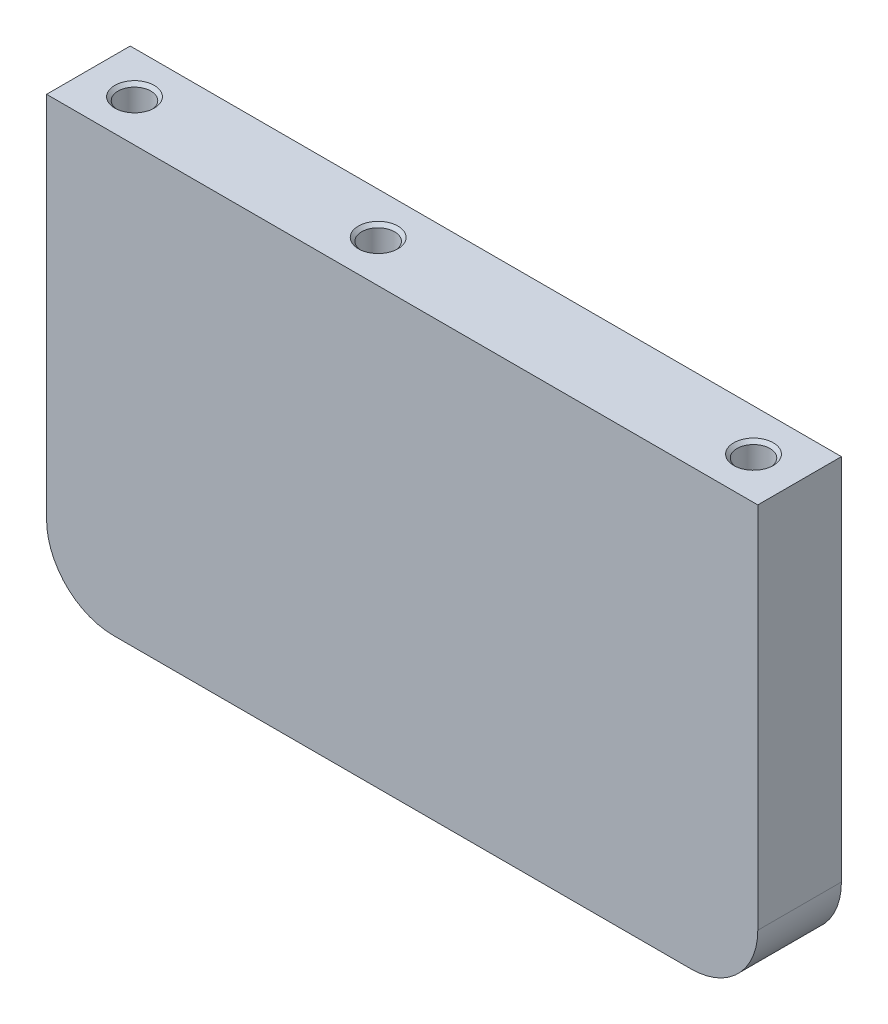
ISO-10303-21;
HEADER;
FILE_DESCRIPTION(('STEP AP214'),'2;1');
FILE_NAME('part.step','',(''),(''),'','','');
FILE_SCHEMA(('AUTOMOTIVE_DESIGN { 1 0 10303 214 1 1 1 1 }'));
ENDSEC;
DATA;
#1=APPLICATION_CONTEXT('core data for automotive mechanical design processes');
#2=APPLICATION_PROTOCOL_DEFINITION('international standard','automotive_design',2000,#1);
#3=PRODUCT_CONTEXT('',#1,'mechanical');
#4=PRODUCT('Part','Part','',(#3));
#5=PRODUCT_RELATED_PRODUCT_CATEGORY('part','',(#4));
#6=PRODUCT_DEFINITION_FORMATION('','',#4);
#7=PRODUCT_DEFINITION_CONTEXT('part definition',#1,'design');
#8=PRODUCT_DEFINITION('design','',#6,#7);
#9=PRODUCT_DEFINITION_SHAPE('','',#8);
#10=(LENGTH_UNIT() NAMED_UNIT(*) SI_UNIT(.MILLI.,.METRE.));
#11=(NAMED_UNIT(*) PLANE_ANGLE_UNIT() SI_UNIT($,.RADIAN.));
#12=(NAMED_UNIT(*) SI_UNIT($,.STERADIAN.) SOLID_ANGLE_UNIT());
#13=UNCERTAINTY_MEASURE_WITH_UNIT(LENGTH_MEASURE(1.E-05),#10,'distance_accuracy_value','');
#14=(GEOMETRIC_REPRESENTATION_CONTEXT(3) GLOBAL_UNCERTAINTY_ASSIGNED_CONTEXT((#13)) GLOBAL_UNIT_ASSIGNED_CONTEXT((#10,
#11,#12)) REPRESENTATION_CONTEXT('',''));
#15=CARTESIAN_POINT('',(0.,0.,0.));
#16=DIRECTION('',(0.,0.,1.));
#17=DIRECTION('',(1.,0.,0.));
#18=AXIS2_PLACEMENT_3D('',#15,#16,#17);
#19=CARTESIAN_POINT('',(-36.,19.05,-6.35));
#20=DIRECTION('',(-1.,0.,0.));
#21=DIRECTION('',(0.,-1.,0.));
#22=AXIS2_PLACEMENT_3D('',#19,#20,#21);
#23=PLANE('',#22);
#24=DIRECTION('',(0.,-1.,0.));
#25=VECTOR('',#24,1.);
#26=CARTESIAN_POINT('',(-36.,19.05,-6.35));
#27=LINE('',#26,#25);
#28=CARTESIAN_POINT('',(-36.,19.05,-6.35));
#29=VERTEX_POINT('',#28);
#30=CARTESIAN_POINT('',(-36.,-8.92,-6.35));
#31=VERTEX_POINT('',#30);
#32=EDGE_CURVE('E116',#29,#31,#27,.T.);
#33=ORIENTED_EDGE('',*,*,#32,.T.);
#34=DIRECTION('',(0.,0.,1.));
#35=VECTOR('',#34,1.);
#36=CARTESIAN_POINT('',(-36.,-8.92,-6.35));
#37=LINE('',#36,#35);
#38=CARTESIAN_POINT('',(-36.,-8.92,0.));
#39=VERTEX_POINT('',#38);
#40=EDGE_CURVE('E157',#31,#39,#37,.T.);
#41=ORIENTED_EDGE('',*,*,#40,.T.);
#42=DIRECTION('',(0.,-1.,0.));
#43=VECTOR('',#42,1.);
#44=CARTESIAN_POINT('',(-36.,19.05,0.));
#45=LINE('',#44,#43);
#46=CARTESIAN_POINT('',(-36.,19.05,0.));
#47=VERTEX_POINT('',#46);
#48=EDGE_CURVE('E121',#47,#39,#45,.T.);
#49=ORIENTED_EDGE('',*,*,#48,.F.);
#50=DIRECTION('',(0.,0.,1.));
#51=VECTOR('',#50,1.);
#52=CARTESIAN_POINT('',(-36.,19.05,-6.35));
#53=LINE('',#52,#51);
#54=EDGE_CURVE('E113',#29,#47,#53,.T.);
#55=ORIENTED_EDGE('',*,*,#54,.F.);
#56=EDGE_LOOP('',(#33,#41,#49,#55));
#57=FACE_BOUND('',#56,.T.);
#58=ADVANCED_FACE('F41',(#57),#23,.T.);
#59=CARTESIAN_POINT('',(-36.,19.05,-6.35));
#60=DIRECTION('',(0.,1.,0.));
#61=DIRECTION('',(0.,0.,1.));
#62=AXIS2_PLACEMENT_3D('',#59,#60,#61);
#63=PLANE('',#62);
#64=CARTESIAN_POINT('',(14.5,19.05,-3.17500000000004));
#65=DIRECTION('',(0.,1.,0.));
#66=DIRECTION('',(0.,0.,1.));
#67=AXIS2_PLACEMENT_3D('',#64,#65,#66);
#68=CIRCLE('',#67,1.5);
#69=CARTESIAN_POINT('',(14.5,19.05,-1.67500000000004));
#70=VERTEX_POINT('',#69);
#71=EDGE_CURVE('E173',#70,#70,#68,.F.);
#72=ORIENTED_EDGE('',*,*,#71,.T.);
#73=EDGE_LOOP('',(#72));
#74=FACE_BOUND('',#73,.T.);
#75=CARTESIAN_POINT('',(-14.0000000000001,19.05,-3.17500000000004));
#76=DIRECTION('',(0.,1.,0.));
#77=DIRECTION('',(0.,0.,1.));
#78=AXIS2_PLACEMENT_3D('',#75,#76,#77);
#79=CIRCLE('',#78,1.5);
#80=CARTESIAN_POINT('',(-14.0000000000001,19.05,-1.67500000000004));
#81=VERTEX_POINT('',#80);
#82=EDGE_CURVE('E169',#81,#81,#79,.F.);
#83=ORIENTED_EDGE('',*,*,#82,.T.);
#84=EDGE_LOOP('',(#83));
#85=FACE_BOUND('',#84,.T.);
#86=CARTESIAN_POINT('',(-32.5,19.05,-3.175));
#87=DIRECTION('',(0.,1.,0.));
#88=DIRECTION('',(0.,0.,1.));
#89=AXIS2_PLACEMENT_3D('',#86,#87,#88);
#90=CIRCLE('',#89,1.5);
#91=CARTESIAN_POINT('',(-32.5,19.05,-1.675));
#92=VERTEX_POINT('',#91);
#93=EDGE_CURVE('E165',#92,#92,#90,.F.);
#94=ORIENTED_EDGE('',*,*,#93,.T.);
#95=EDGE_LOOP('',(#94));
#96=FACE_BOUND('',#95,.T.);
#97=DIRECTION('',(-1.,0.,0.));
#98=VECTOR('',#97,1.);
#99=CARTESIAN_POINT('',(-36.,19.05,0.));
#100=LINE('',#99,#98);
#101=CARTESIAN_POINT('',(18.,19.05,0.));
#102=VERTEX_POINT('',#101);
#103=EDGE_CURVE('E111',#102,#47,#100,.T.);
#104=ORIENTED_EDGE('',*,*,#103,.F.);
#105=DIRECTION('',(0.,0.,1.));
#106=VECTOR('',#105,1.);
#107=CARTESIAN_POINT('',(18.,19.05,-6.35));
#108=LINE('',#107,#106);
#109=CARTESIAN_POINT('',(18.,19.05,-6.35));
#110=VERTEX_POINT('',#109);
#111=EDGE_CURVE('E99',#110,#102,#108,.T.);
#112=ORIENTED_EDGE('',*,*,#111,.F.);
#113=DIRECTION('',(-1.,0.,0.));
#114=VECTOR('',#113,1.);
#115=CARTESIAN_POINT('',(-36.,19.05,-6.35));
#116=LINE('',#115,#114);
#117=EDGE_CURVE('E104',#110,#29,#116,.T.);
#118=ORIENTED_EDGE('',*,*,#117,.T.);
#119=ORIENTED_EDGE('',*,*,#54,.T.);
#120=EDGE_LOOP('',(#104,#112,#118,#119));
#121=FACE_BOUND('',#120,.T.);
#122=ADVANCED_FACE('F109',(#74,#85,#96,#121),#63,.T.);
#123=CARTESIAN_POINT('',(18.,19.05,-6.35));
#124=DIRECTION('',(1.,0.,0.));
#125=DIRECTION('',(0.,1.,0.));
#126=AXIS2_PLACEMENT_3D('',#123,#124,#125);
#127=PLANE('',#126);
#128=DIRECTION('',(0.,1.,0.));
#129=VECTOR('',#128,1.);
#130=CARTESIAN_POINT('',(18.,19.05,0.));
#131=LINE('',#130,#129);
#132=CARTESIAN_POINT('',(18.,-8.92,0.));
#133=VERTEX_POINT('',#132);
#134=EDGE_CURVE('E130',#133,#102,#131,.T.);
#135=ORIENTED_EDGE('',*,*,#134,.F.);
#136=DIRECTION('',(0.,0.,1.));
#137=VECTOR('',#136,1.);
#138=CARTESIAN_POINT('',(18.,-8.92,-6.35));
#139=LINE('',#138,#137);
#140=CARTESIAN_POINT('',(18.,-8.92,-6.35));
#141=VERTEX_POINT('',#140);
#142=EDGE_CURVE('E65',#133,#141,#139,.F.);
#143=ORIENTED_EDGE('',*,*,#142,.T.);
#144=DIRECTION('',(0.,1.,0.));
#145=VECTOR('',#144,1.);
#146=CARTESIAN_POINT('',(18.,19.05,-6.35));
#147=LINE('',#146,#145);
#148=EDGE_CURVE('E96',#141,#110,#147,.T.);
#149=ORIENTED_EDGE('',*,*,#148,.T.);
#150=ORIENTED_EDGE('',*,*,#111,.T.);
#151=EDGE_LOOP('',(#135,#143,#149,#150));
#152=FACE_BOUND('',#151,.T.);
#153=ADVANCED_FACE('F98',(#152),#127,.T.);
#154=CARTESIAN_POINT('',(-36.,-14.,-6.35));
#155=DIRECTION('',(0.,-1.,0.));
#156=DIRECTION('',(0.,0.,-1.));
#157=AXIS2_PLACEMENT_3D('',#154,#155,#156);
#158=PLANE('',#157);
#159=DIRECTION('',(1.,0.,0.));
#160=VECTOR('',#159,1.);
#161=CARTESIAN_POINT('',(-36.,-14.,-6.35));
#162=LINE('',#161,#160);
#163=CARTESIAN_POINT('',(-30.92,-14.,-6.35));
#164=VERTEX_POINT('',#163);
#165=CARTESIAN_POINT('',(12.92,-14.,-6.35));
#166=VERTEX_POINT('',#165);
#167=EDGE_CURVE('E105',#164,#166,#162,.T.);
#168=ORIENTED_EDGE('',*,*,#167,.T.);
#169=DIRECTION('',(0.,0.,1.));
#170=VECTOR('',#169,1.);
#171=CARTESIAN_POINT('',(12.92,-14.,-6.35));
#172=LINE('',#171,#170);
#173=CARTESIAN_POINT('',(12.92,-14.,0.));
#174=VERTEX_POINT('',#173);
#175=EDGE_CURVE('E140',#166,#174,#172,.T.);
#176=ORIENTED_EDGE('',*,*,#175,.T.);
#177=DIRECTION('',(1.,0.,0.));
#178=VECTOR('',#177,1.);
#179=CARTESIAN_POINT('',(-36.,-14.,0.));
#180=LINE('',#179,#178);
#181=CARTESIAN_POINT('',(-30.92,-14.,0.));
#182=VERTEX_POINT('',#181);
#183=EDGE_CURVE('E125',#182,#174,#180,.T.);
#184=ORIENTED_EDGE('',*,*,#183,.F.);
#185=DIRECTION('',(0.,0.,1.));
#186=VECTOR('',#185,1.);
#187=CARTESIAN_POINT('',(-30.92,-14.,-6.35));
#188=LINE('',#187,#186);
#189=EDGE_CURVE('E136',#182,#164,#188,.F.);
#190=ORIENTED_EDGE('',*,*,#189,.T.);
#191=EDGE_LOOP('',(#168,#176,#184,#190));
#192=FACE_BOUND('',#191,.T.);
#193=ADVANCED_FACE('F206',(#192),#158,.T.);
#194=CARTESIAN_POINT('',(0.,0.,-6.35));
#195=DIRECTION('',(0.,0.,1.));
#196=DIRECTION('',(1.,0.,0.));
#197=AXIS2_PLACEMENT_3D('',#194,#195,#196);
#198=PLANE('',#197);
#199=CARTESIAN_POINT('',(-25.,0.,-6.35));
#200=DIRECTION('',(0.,0.,-1.));
#201=DIRECTION('',(-1.,0.,0.));
#202=AXIS2_PLACEMENT_3D('',#199,#200,#201);
#203=CIRCLE('',#202,3.35);
#204=CARTESIAN_POINT('',(-28.35,0.,-6.35));
#205=VERTEX_POINT('',#204);
#206=EDGE_CURVE('E252',#205,#205,#203,.T.);
#207=ORIENTED_EDGE('',*,*,#206,.F.);
#208=EDGE_LOOP('',(#207));
#209=FACE_BOUND('',#208,.T.);
#210=CARTESIAN_POINT('',(0.,0.,-6.35));
#211=DIRECTION('',(0.,0.,-1.));
#212=DIRECTION('',(-1.,0.,0.));
#213=AXIS2_PLACEMENT_3D('',#210,#211,#212);
#214=CIRCLE('',#213,11.05);
#215=CARTESIAN_POINT('',(-11.05,0.,-6.35));
#216=VERTEX_POINT('',#215);
#217=EDGE_CURVE('E253',#216,#216,#214,.T.);
#218=ORIENTED_EDGE('',*,*,#217,.F.);
#219=EDGE_LOOP('',(#218));
#220=FACE_BOUND('',#219,.T.);
#221=ORIENTED_EDGE('',*,*,#148,.F.);
#222=CARTESIAN_POINT('',(12.92,-8.92,-6.35));
#223=DIRECTION('',(0.,0.,1.));
#224=DIRECTION('',(1.,0.,0.));
#225=AXIS2_PLACEMENT_3D('',#222,#223,#224);
#226=CIRCLE('',#225,5.08);
#227=EDGE_CURVE('E154',#141,#166,#226,.F.);
#228=ORIENTED_EDGE('',*,*,#227,.T.);
#229=ORIENTED_EDGE('',*,*,#167,.F.);
#230=CARTESIAN_POINT('',(-30.92,-8.92,-6.35));
#231=DIRECTION('',(0.,0.,1.));
#232=DIRECTION('',(1.,0.,0.));
#233=AXIS2_PLACEMENT_3D('',#230,#231,#232);
#234=CIRCLE('',#233,5.08);
#235=EDGE_CURVE('E57',#164,#31,#234,.F.);
#236=ORIENTED_EDGE('',*,*,#235,.T.);
#237=ORIENTED_EDGE('',*,*,#32,.F.);
#238=ORIENTED_EDGE('',*,*,#117,.F.);
#239=EDGE_LOOP('',(#221,#228,#229,#236,#237,#238));
#240=FACE_BOUND('',#239,.T.);
#241=ADVANCED_FACE('F115',(#209,#220,#240),#198,.F.);
#242=CARTESIAN_POINT('',(0.,0.,0.));
#243=DIRECTION('',(0.,0.,1.));
#244=DIRECTION('',(1.,0.,0.));
#245=AXIS2_PLACEMENT_3D('',#242,#243,#244);
#246=PLANE('',#245);
#247=ORIENTED_EDGE('',*,*,#183,.T.);
#248=CARTESIAN_POINT('',(12.92,-8.92,0.));
#249=DIRECTION('',(0.,0.,1.));
#250=DIRECTION('',(1.,0.,0.));
#251=AXIS2_PLACEMENT_3D('',#248,#249,#250);
#252=CIRCLE('',#251,5.08);
#253=EDGE_CURVE('E147',#174,#133,#252,.T.);
#254=ORIENTED_EDGE('',*,*,#253,.T.);
#255=ORIENTED_EDGE('',*,*,#134,.T.);
#256=ORIENTED_EDGE('',*,*,#103,.T.);
#257=ORIENTED_EDGE('',*,*,#48,.T.);
#258=CARTESIAN_POINT('',(-30.92,-8.92,0.));
#259=DIRECTION('',(0.,0.,1.));
#260=DIRECTION('',(1.,0.,0.));
#261=AXIS2_PLACEMENT_3D('',#258,#259,#260);
#262=CIRCLE('',#261,5.08);
#263=EDGE_CURVE('E144',#39,#182,#262,.T.);
#264=ORIENTED_EDGE('',*,*,#263,.T.);
#265=EDGE_LOOP('',(#247,#254,#255,#256,#257,#264));
#266=FACE_BOUND('',#265,.T.);
#267=ADVANCED_FACE('F227',(#266),#246,.T.);
#268=CARTESIAN_POINT('',(14.5,4.05,-3.17500000000004));
#269=DIRECTION('',(0.,1.,0.));
#270=DIRECTION('',(0.,0.,1.));
#271=AXIS2_PLACEMENT_3D('',#268,#269,#270);
#272=CYLINDRICAL_SURFACE('',#271,1.25);
#273=CARTESIAN_POINT('',(14.5,18.8,-3.17500000000004));
#274=DIRECTION('',(0.,1.,0.));
#275=DIRECTION('',(0.,0.,1.));
#276=AXIS2_PLACEMENT_3D('',#273,#274,#275);
#277=CIRCLE('',#276,1.25);
#278=CARTESIAN_POINT('',(14.5,18.8,-1.92500000000004));
#279=VERTEX_POINT('',#278);
#280=EDGE_CURVE('E161',#279,#279,#277,.T.);
#281=ORIENTED_EDGE('',*,*,#280,.T.);
#282=EDGE_LOOP('',(#281));
#283=FACE_BOUND('',#282,.T.);
#284=CARTESIAN_POINT('',(14.5,4.05,-3.17500000000004));
#285=DIRECTION('',(0.,1.,0.));
#286=DIRECTION('',(0.,0.,1.));
#287=AXIS2_PLACEMENT_3D('',#284,#285,#286);
#288=CIRCLE('',#287,1.25);
#289=CARTESIAN_POINT('',(14.5,4.05,-1.92500000000004));
#290=VERTEX_POINT('',#289);
#291=EDGE_CURVE('E236',#290,#290,#288,.T.);
#292=ORIENTED_EDGE('',*,*,#291,.F.);
#293=EDGE_LOOP('',(#292));
#294=FACE_BOUND('',#293,.T.);
#295=ADVANCED_FACE('F299',(#283,#294),#272,.F.);
#296=CARTESIAN_POINT('',(14.5,4.05,-3.17500000000004));
#297=DIRECTION('',(0.,1.,0.));
#298=DIRECTION('',(0.,0.,1.));
#299=AXIS2_PLACEMENT_3D('',#296,#297,#298);
#300=PLANE('',#299);
#301=ORIENTED_EDGE('',*,*,#291,.T.);
#302=EDGE_LOOP('',(#301));
#303=FACE_BOUND('',#302,.T.);
#304=ADVANCED_FACE('F296',(#303),#300,.T.);
#305=CARTESIAN_POINT('',(-14.0000000000001,4.05,-3.17500000000004));
#306=DIRECTION('',(0.,1.,0.));
#307=DIRECTION('',(0.,0.,1.));
#308=AXIS2_PLACEMENT_3D('',#305,#306,#307);
#309=CYLINDRICAL_SURFACE('',#308,1.25);
#310=CARTESIAN_POINT('',(-14.0000000000001,18.8,-3.17500000000004));
#311=DIRECTION('',(0.,1.,0.));
#312=DIRECTION('',(0.,0.,1.));
#313=AXIS2_PLACEMENT_3D('',#310,#311,#312);
#314=CIRCLE('',#313,1.25);
#315=CARTESIAN_POINT('',(-14.0000000000001,18.8,-1.92500000000004));
#316=VERTEX_POINT('',#315);
#317=EDGE_CURVE('E50',#316,#316,#314,.T.);
#318=ORIENTED_EDGE('',*,*,#317,.T.);
#319=EDGE_LOOP('',(#318));
#320=FACE_BOUND('',#319,.T.);
#321=CARTESIAN_POINT('',(-14.0000000000001,4.05,-3.17500000000004));
#322=DIRECTION('',(0.,1.,0.));
#323=DIRECTION('',(0.,0.,1.));
#324=AXIS2_PLACEMENT_3D('',#321,#322,#323);
#325=CIRCLE('',#324,1.25);
#326=CARTESIAN_POINT('',(-14.0000000000001,4.05,-1.92500000000004));
#327=VERTEX_POINT('',#326);
#328=EDGE_CURVE('E240',#327,#327,#325,.T.);
#329=ORIENTED_EDGE('',*,*,#328,.F.);
#330=EDGE_LOOP('',(#329));
#331=FACE_BOUND('',#330,.T.);
#332=ADVANCED_FACE('F180',(#320,#331),#309,.F.);
#333=CARTESIAN_POINT('',(-14.0000000000001,4.05,-3.17500000000004));
#334=DIRECTION('',(0.,1.,0.));
#335=DIRECTION('',(0.,0.,1.));
#336=AXIS2_PLACEMENT_3D('',#333,#334,#335);
#337=PLANE('',#336);
#338=ORIENTED_EDGE('',*,*,#328,.T.);
#339=EDGE_LOOP('',(#338));
#340=FACE_BOUND('',#339,.T.);
#341=ADVANCED_FACE('F289',(#340),#337,.T.);
#342=CARTESIAN_POINT('',(-32.5,4.05,-3.175));
#343=DIRECTION('',(0.,1.,0.));
#344=DIRECTION('',(0.,0.,1.));
#345=AXIS2_PLACEMENT_3D('',#342,#343,#344);
#346=CYLINDRICAL_SURFACE('',#345,1.25);
#347=CARTESIAN_POINT('',(-32.5,18.8,-3.175));
#348=DIRECTION('',(0.,1.,0.));
#349=DIRECTION('',(0.,0.,1.));
#350=AXIS2_PLACEMENT_3D('',#347,#348,#349);
#351=CIRCLE('',#350,1.25);
#352=CARTESIAN_POINT('',(-32.5,18.8,-1.925));
#353=VERTEX_POINT('',#352);
#354=EDGE_CURVE('E12',#353,#353,#351,.T.);
#355=ORIENTED_EDGE('',*,*,#354,.T.);
#356=EDGE_LOOP('',(#355));
#357=FACE_BOUND('',#356,.T.);
#358=CARTESIAN_POINT('',(-32.5,4.05,-3.175));
#359=DIRECTION('',(0.,1.,0.));
#360=DIRECTION('',(0.,0.,1.));
#361=AXIS2_PLACEMENT_3D('',#358,#359,#360);
#362=CIRCLE('',#361,1.25);
#363=CARTESIAN_POINT('',(-32.5,4.05,-1.925));
#364=VERTEX_POINT('',#363);
#365=EDGE_CURVE('E126',#364,#364,#362,.T.);
#366=ORIENTED_EDGE('',*,*,#365,.F.);
#367=EDGE_LOOP('',(#366));
#368=FACE_BOUND('',#367,.T.);
#369=ADVANCED_FACE('F285',(#357,#368),#346,.F.);
#370=CARTESIAN_POINT('',(-32.5,4.05,-3.175));
#371=DIRECTION('',(0.,1.,0.));
#372=DIRECTION('',(0.,0.,1.));
#373=AXIS2_PLACEMENT_3D('',#370,#371,#372);
#374=PLANE('',#373);
#375=ORIENTED_EDGE('',*,*,#365,.T.);
#376=EDGE_LOOP('',(#375));
#377=FACE_BOUND('',#376,.T.);
#378=ADVANCED_FACE('F212',(#377),#374,.T.);
#379=CARTESIAN_POINT('',(12.92,-8.92,-6.35));
#380=DIRECTION('',(0.,0.,1.));
#381=DIRECTION('',(1.,0.,0.));
#382=AXIS2_PLACEMENT_3D('',#379,#380,#381);
#383=CYLINDRICAL_SURFACE('',#382,5.08);
#384=ORIENTED_EDGE('',*,*,#227,.F.);
#385=ORIENTED_EDGE('',*,*,#142,.F.);
#386=ORIENTED_EDGE('',*,*,#253,.F.);
#387=ORIENTED_EDGE('',*,*,#175,.F.);
#388=EDGE_LOOP('',(#384,#385,#386,#387));
#389=FACE_BOUND('',#388,.T.);
#390=ADVANCED_FACE('F208',(#389),#383,.T.);
#391=CARTESIAN_POINT('',(-30.92,-8.92,-6.35));
#392=DIRECTION('',(0.,0.,1.));
#393=DIRECTION('',(1.,0.,0.));
#394=AXIS2_PLACEMENT_3D('',#391,#392,#393);
#395=CYLINDRICAL_SURFACE('',#394,5.08);
#396=ORIENTED_EDGE('',*,*,#235,.F.);
#397=ORIENTED_EDGE('',*,*,#189,.F.);
#398=ORIENTED_EDGE('',*,*,#263,.F.);
#399=ORIENTED_EDGE('',*,*,#40,.F.);
#400=EDGE_LOOP('',(#396,#397,#398,#399));
#401=FACE_BOUND('',#400,.T.);
#402=ADVANCED_FACE('F211',(#401),#395,.T.);
#403=CARTESIAN_POINT('',(0.,0.,-1.5875));
#404=DIRECTION('',(0.,0.,1.));
#405=DIRECTION('',(1.,0.,0.));
#406=AXIS2_PLACEMENT_3D('',#403,#404,#405);
#407=PLANE('',#406);
#408=CARTESIAN_POINT('',(0.,0.,-1.5875));
#409=DIRECTION('',(0.,0.,1.));
#410=DIRECTION('',(1.,0.,0.));
#411=AXIS2_PLACEMENT_3D('',#408,#409,#410);
#412=CIRCLE('',#411,11.05);
#413=CARTESIAN_POINT('',(11.05,0.,-1.5875));
#414=VERTEX_POINT('',#413);
#415=EDGE_CURVE('E248',#414,#414,#412,.F.);
#416=ORIENTED_EDGE('',*,*,#415,.T.);
#417=EDGE_LOOP('',(#416));
#418=FACE_BOUND('',#417,.T.);
#419=ADVANCED_FACE('F215',(#418),#407,.F.);
#420=CARTESIAN_POINT('',(0.,0.,31.2541197284454));
#421=DIRECTION('',(0.,0.,-1.));
#422=DIRECTION('',(-1.,0.,0.));
#423=AXIS2_PLACEMENT_3D('',#420,#421,#422);
#424=CYLINDRICAL_SURFACE('',#423,11.05);
#425=ORIENTED_EDGE('',*,*,#217,.T.);
#426=EDGE_LOOP('',(#425));
#427=FACE_BOUND('',#426,.T.);
#428=ORIENTED_EDGE('',*,*,#415,.F.);
#429=EDGE_LOOP('',(#428));
#430=FACE_BOUND('',#429,.T.);
#431=ADVANCED_FACE('F220',(#427,#430),#424,.F.);
#432=CARTESIAN_POINT('',(0.,0.,-1.5875));
#433=DIRECTION('',(0.,0.,1.));
#434=DIRECTION('',(1.,0.,0.));
#435=AXIS2_PLACEMENT_3D('',#432,#433,#434);
#436=PLANE('',#435);
#437=CARTESIAN_POINT('',(-25.,0.,-1.5875));
#438=DIRECTION('',(0.,0.,1.));
#439=DIRECTION('',(1.,0.,0.));
#440=AXIS2_PLACEMENT_3D('',#437,#438,#439);
#441=CIRCLE('',#440,3.35);
#442=CARTESIAN_POINT('',(-21.65,0.,-1.5875));
#443=VERTEX_POINT('',#442);
#444=EDGE_CURVE('E241',#443,#443,#441,.F.);
#445=ORIENTED_EDGE('',*,*,#444,.T.);
#446=EDGE_LOOP('',(#445));
#447=FACE_BOUND('',#446,.T.);
#448=ADVANCED_FACE('F273',(#447),#436,.F.);
#449=CARTESIAN_POINT('',(-25.,0.,31.2541197284454));
#450=DIRECTION('',(0.,0.,-1.));
#451=DIRECTION('',(-1.,0.,0.));
#452=AXIS2_PLACEMENT_3D('',#449,#450,#451);
#453=CYLINDRICAL_SURFACE('',#452,3.35);
#454=ORIENTED_EDGE('',*,*,#206,.T.);
#455=EDGE_LOOP('',(#454));
#456=FACE_BOUND('',#455,.T.);
#457=ORIENTED_EDGE('',*,*,#444,.F.);
#458=EDGE_LOOP('',(#457));
#459=FACE_BOUND('',#458,.T.);
#460=ADVANCED_FACE('F192',(#456,#459),#453,.F.);
#461=CARTESIAN_POINT('',(14.5,18.8,-3.17500000000004));
#462=DIRECTION('',(0.,1.,0.));
#463=DIRECTION('',(0.,0.,1.));
#464=AXIS2_PLACEMENT_3D('',#461,#462,#463);
#465=CONICAL_SURFACE('',#464,1.25,0.785398163397441);
#466=ORIENTED_EDGE('',*,*,#71,.F.);
#467=EDGE_LOOP('',(#466));
#468=FACE_BOUND('',#467,.T.);
#469=ORIENTED_EDGE('',*,*,#280,.F.);
#470=EDGE_LOOP('',(#469));
#471=FACE_BOUND('',#470,.T.);
#472=ADVANCED_FACE('F185',(#468,#471),#465,.F.);
#473=CARTESIAN_POINT('',(-14.0000000000001,18.8,-3.17500000000004));
#474=DIRECTION('',(0.,1.,0.));
#475=DIRECTION('',(0.,0.,1.));
#476=AXIS2_PLACEMENT_3D('',#473,#474,#475);
#477=CONICAL_SURFACE('',#476,1.25,0.785398163397441);
#478=ORIENTED_EDGE('',*,*,#82,.F.);
#479=EDGE_LOOP('',(#478));
#480=FACE_BOUND('',#479,.T.);
#481=ORIENTED_EDGE('',*,*,#317,.F.);
#482=EDGE_LOOP('',(#481));
#483=FACE_BOUND('',#482,.T.);
#484=ADVANCED_FACE('F183',(#480,#483),#477,.F.);
#485=CARTESIAN_POINT('',(-32.5,18.8,-3.175));
#486=DIRECTION('',(0.,1.,0.));
#487=DIRECTION('',(0.,0.,1.));
#488=AXIS2_PLACEMENT_3D('',#485,#486,#487);
#489=CONICAL_SURFACE('',#488,1.25,0.785398163397441);
#490=ORIENTED_EDGE('',*,*,#93,.F.);
#491=EDGE_LOOP('',(#490));
#492=FACE_BOUND('',#491,.T.);
#493=ORIENTED_EDGE('',*,*,#354,.F.);
#494=EDGE_LOOP('',(#493));
#495=FACE_BOUND('',#494,.T.);
#496=ADVANCED_FACE('F43',(#492,#495),#489,.F.);
#497=CLOSED_SHELL('',(#58,#122,#153,#193,#241,#267,#295,#304,#332,#341,#369,#378,#390,#402,#419,
#431,#448,#460,#472,#484,#496));
#498=MANIFOLD_SOLID_BREP('B2',#497);
#499=ADVANCED_BREP_SHAPE_REPRESENTATION('',(#18,#498),#14);
#500=SHAPE_DEFINITION_REPRESENTATION(#9,#499);
ENDSEC;
END-ISO-10303-21;
